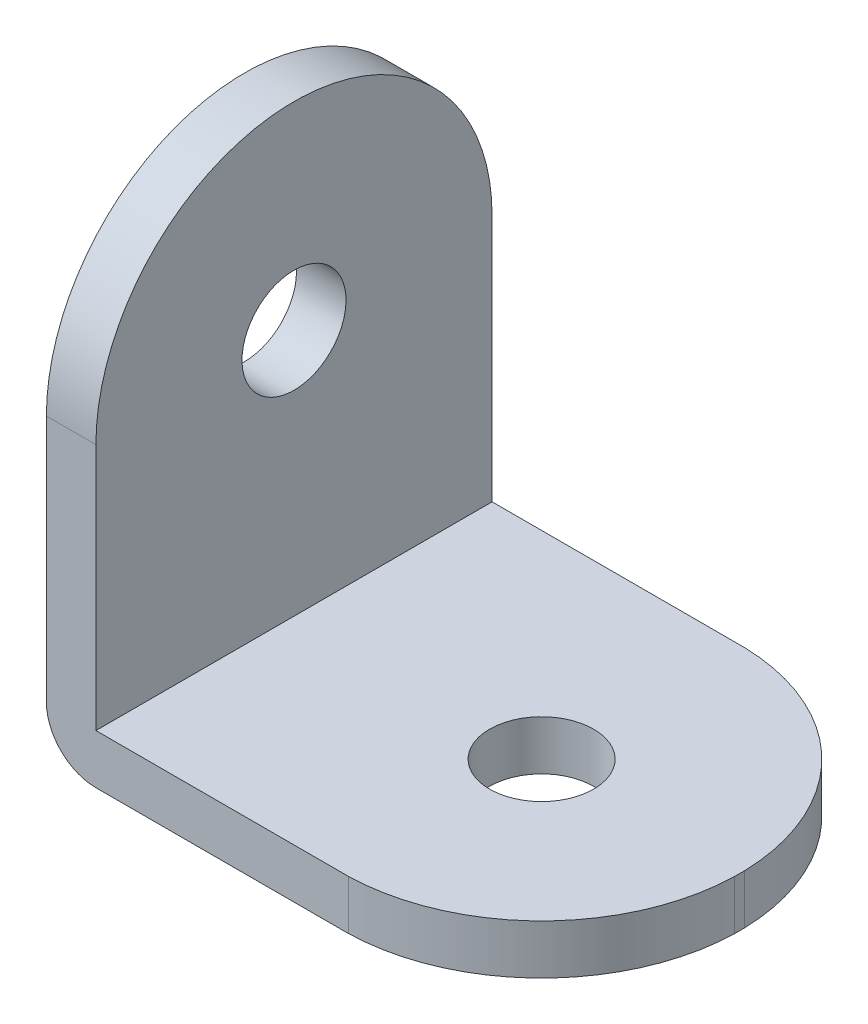
ISO-10303-21;
HEADER;
FILE_DESCRIPTION(('STEP AP214'),'2;1');
FILE_NAME('part.step','',(''),(''),'','','');
FILE_SCHEMA(('AUTOMOTIVE_DESIGN { 1 0 10303 214 1 1 1 1 }'));
ENDSEC;
DATA;
#1=APPLICATION_CONTEXT('core data for automotive mechanical design processes');
#2=APPLICATION_PROTOCOL_DEFINITION('international standard','automotive_design',2000,#1);
#3=PRODUCT_CONTEXT('',#1,'mechanical');
#4=PRODUCT('Part','Part','',(#3));
#5=PRODUCT_RELATED_PRODUCT_CATEGORY('part','',(#4));
#6=PRODUCT_DEFINITION_FORMATION('','',#4);
#7=PRODUCT_DEFINITION_CONTEXT('part definition',#1,'design');
#8=PRODUCT_DEFINITION('design','',#6,#7);
#9=PRODUCT_DEFINITION_SHAPE('','',#8);
#10=(LENGTH_UNIT() NAMED_UNIT(*) SI_UNIT(.MILLI.,.METRE.));
#11=(NAMED_UNIT(*) PLANE_ANGLE_UNIT() SI_UNIT($,.RADIAN.));
#12=(NAMED_UNIT(*) SI_UNIT($,.STERADIAN.) SOLID_ANGLE_UNIT());
#13=UNCERTAINTY_MEASURE_WITH_UNIT(LENGTH_MEASURE(1.E-05),#10,'distance_accuracy_value','');
#14=(GEOMETRIC_REPRESENTATION_CONTEXT(3) GLOBAL_UNCERTAINTY_ASSIGNED_CONTEXT((#13)) GLOBAL_UNIT_ASSIGNED_CONTEXT((#10,
#11,#12)) REPRESENTATION_CONTEXT('',''));
#15=CARTESIAN_POINT('',(0.,0.,0.));
#16=DIRECTION('',(0.,0.,1.));
#17=DIRECTION('',(1.,0.,0.));
#18=AXIS2_PLACEMENT_3D('',#15,#16,#17);
#19=CARTESIAN_POINT('',(-10.,-10.,16.));
#20=DIRECTION('',(1.,0.,0.));
#21=DIRECTION('',(0.,0.,-1.));
#22=AXIS2_PLACEMENT_3D('',#19,#20,#21);
#23=PLANE('',#22);
#24=CARTESIAN_POINT('',(-10.,2.,8.));
#25=DIRECTION('',(1.,0.,0.));
#26=DIRECTION('',(0.,0.,-1.));
#27=AXIS2_PLACEMENT_3D('',#24,#25,#26);
#28=CIRCLE('',#27,2.1);
#29=CARTESIAN_POINT('',(-10.,2.,5.9));
#30=VERTEX_POINT('',#29);
#31=EDGE_CURVE('E158',#30,#30,#28,.T.);
#32=ORIENTED_EDGE('',*,*,#31,.T.);
#33=EDGE_LOOP('',(#32));
#34=FACE_BOUND('',#33,.T.);
#35=DIRECTION('',(0.,0.,1.));
#36=VECTOR('',#35,1.);
#37=CARTESIAN_POINT('',(-10.,-7.99999999999999,0.));
#38=LINE('',#37,#36);
#39=CARTESIAN_POINT('',(-10.,-7.99999999999999,0.));
#40=VERTEX_POINT('',#39);
#41=CARTESIAN_POINT('',(-10.,-7.99999999999999,16.));
#42=VERTEX_POINT('',#41);
#43=EDGE_CURVE('E108',#40,#42,#38,.T.);
#44=ORIENTED_EDGE('',*,*,#43,.T.);
#45=DIRECTION('',(0.,-1.,0.));
#46=VECTOR('',#45,1.);
#47=CARTESIAN_POINT('',(-10.,-10.,16.));
#48=LINE('',#47,#46);
#49=CARTESIAN_POINT('',(-10.,2.,16.));
#50=VERTEX_POINT('',#49);
#51=EDGE_CURVE('E130',#50,#42,#48,.T.);
#52=ORIENTED_EDGE('',*,*,#51,.F.);
#53=CARTESIAN_POINT('',(-10.,2.,8.));
#54=DIRECTION('',(1.,0.,0.));
#55=DIRECTION('',(0.,0.,-1.));
#56=AXIS2_PLACEMENT_3D('',#53,#54,#55);
#57=CIRCLE('',#56,8.);
#58=CARTESIAN_POINT('',(-10.,2.,0.));
#59=VERTEX_POINT('',#58);
#60=EDGE_CURVE('E127',#50,#59,#57,.F.);
#61=ORIENTED_EDGE('',*,*,#60,.T.);
#62=DIRECTION('',(0.,-1.,0.));
#63=VECTOR('',#62,1.);
#64=CARTESIAN_POINT('',(-10.,-10.,0.));
#65=LINE('',#64,#63);
#66=EDGE_CURVE('E124',#59,#40,#65,.T.);
#67=ORIENTED_EDGE('',*,*,#66,.T.);
#68=EDGE_LOOP('',(#44,#52,#61,#67));
#69=FACE_BOUND('',#68,.T.);
#70=ADVANCED_FACE('F40',(#34,#69),#23,.F.);
#71=CARTESIAN_POINT('',(0.,0.,0.));
#72=DIRECTION('',(0.,0.,1.));
#73=DIRECTION('',(1.,0.,0.));
#74=AXIS2_PLACEMENT_3D('',#71,#72,#73);
#75=PLANE('',#74);
#76=DIRECTION('',(1.,0.,0.));
#77=VECTOR('',#76,1.);
#78=CARTESIAN_POINT('',(10.,-10.,0.));
#79=LINE('',#78,#77);
#80=CARTESIAN_POINT('',(-8.,-10.,0.));
#81=VERTEX_POINT('',#80);
#82=CARTESIAN_POINT('',(2.20117887972488,-10.,0.));
#83=VERTEX_POINT('',#82);
#84=EDGE_CURVE('E125',#81,#83,#79,.T.);
#85=ORIENTED_EDGE('',*,*,#84,.F.);
#86=CARTESIAN_POINT('',(-8.,-8.,0.));
#87=DIRECTION('',(0.,0.,-1.));
#88=DIRECTION('',(1.,0.,0.));
#89=AXIS2_PLACEMENT_3D('',#86,#87,#88);
#90=CIRCLE('',#89,2.);
#91=EDGE_CURVE('E111',#81,#40,#90,.T.);
#92=ORIENTED_EDGE('',*,*,#91,.T.);
#93=ORIENTED_EDGE('',*,*,#66,.F.);
#94=DIRECTION('',(1.,0.,0.));
#95=VECTOR('',#94,1.);
#96=CARTESIAN_POINT('',(-24.,2.,0.));
#97=LINE('',#96,#95);
#98=CARTESIAN_POINT('',(-8.,2.,0.));
#99=VERTEX_POINT('',#98);
#100=EDGE_CURVE('E11',#99,#59,#97,.F.);
#101=ORIENTED_EDGE('',*,*,#100,.F.);
#102=DIRECTION('',(0.,-1.,0.));
#103=VECTOR('',#102,1.);
#104=CARTESIAN_POINT('',(-8.00000000000001,10.,0.));
#105=LINE('',#104,#103);
#106=CARTESIAN_POINT('',(-8.,-8.,0.));
#107=VERTEX_POINT('',#106);
#108=EDGE_CURVE('E155',#99,#107,#105,.T.);
#109=ORIENTED_EDGE('',*,*,#108,.T.);
#110=DIRECTION('',(1.,0.,0.));
#111=VECTOR('',#110,1.);
#112=CARTESIAN_POINT('',(-8.,-8.,0.));
#113=LINE('',#112,#111);
#114=CARTESIAN_POINT('',(2.20117887972488,-8.,0.));
#115=VERTEX_POINT('',#114);
#116=EDGE_CURVE('E150',#107,#115,#113,.T.);
#117=ORIENTED_EDGE('',*,*,#116,.T.);
#118=DIRECTION('',(0.,1.,0.));
#119=VECTOR('',#118,1.);
#120=CARTESIAN_POINT('',(2.20117887972488,-24.,0.));
#121=LINE('',#120,#119);
#122=EDGE_CURVE('E62',#83,#115,#121,.T.);
#123=ORIENTED_EDGE('',*,*,#122,.F.);
#124=EDGE_LOOP('',(#85,#92,#93,#101,#109,#117,#123));
#125=FACE_BOUND('',#124,.T.);
#126=ADVANCED_FACE('F122',(#125),#75,.F.);
#127=CARTESIAN_POINT('',(0.,0.,16.));
#128=DIRECTION('',(0.,0.,1.));
#129=DIRECTION('',(1.,0.,0.));
#130=AXIS2_PLACEMENT_3D('',#127,#128,#129);
#131=PLANE('',#130);
#132=CARTESIAN_POINT('',(-8.,-8.,16.));
#133=DIRECTION('',(0.,0.,-1.));
#134=DIRECTION('',(1.,0.,0.));
#135=AXIS2_PLACEMENT_3D('',#132,#133,#134);
#136=CIRCLE('',#135,2.);
#137=CARTESIAN_POINT('',(-8.,-10.,16.));
#138=VERTEX_POINT('',#137);
#139=EDGE_CURVE('E54',#138,#42,#136,.T.);
#140=ORIENTED_EDGE('',*,*,#139,.F.);
#141=DIRECTION('',(1.,0.,0.));
#142=VECTOR('',#141,1.);
#143=CARTESIAN_POINT('',(10.,-10.,16.));
#144=LINE('',#143,#142);
#145=CARTESIAN_POINT('',(2.20117887972485,-10.,16.));
#146=VERTEX_POINT('',#145);
#147=EDGE_CURVE('E136',#138,#146,#144,.T.);
#148=ORIENTED_EDGE('',*,*,#147,.T.);
#149=DIRECTION('',(0.,1.,0.));
#150=VECTOR('',#149,1.);
#151=CARTESIAN_POINT('',(2.20117887972485,-24.,16.));
#152=LINE('',#151,#150);
#153=CARTESIAN_POINT('',(2.20117887972485,-8.,16.));
#154=VERTEX_POINT('',#153);
#155=EDGE_CURVE('E182',#146,#154,#152,.T.);
#156=ORIENTED_EDGE('',*,*,#155,.T.);
#157=DIRECTION('',(1.,0.,0.));
#158=VECTOR('',#157,1.);
#159=CARTESIAN_POINT('',(-8.,-8.,16.));
#160=LINE('',#159,#158);
#161=CARTESIAN_POINT('',(-8.,-8.,16.));
#162=VERTEX_POINT('',#161);
#163=EDGE_CURVE('E152',#162,#154,#160,.T.);
#164=ORIENTED_EDGE('',*,*,#163,.F.);
#165=DIRECTION('',(0.,-1.,0.));
#166=VECTOR('',#165,1.);
#167=CARTESIAN_POINT('',(-8.00000000000001,10.,16.));
#168=LINE('',#167,#166);
#169=CARTESIAN_POINT('',(-8.,2.,16.));
#170=VERTEX_POINT('',#169);
#171=EDGE_CURVE('E156',#170,#162,#168,.T.);
#172=ORIENTED_EDGE('',*,*,#171,.F.);
#173=DIRECTION('',(1.,0.,0.));
#174=VECTOR('',#173,1.);
#175=CARTESIAN_POINT('',(-24.,2.,16.));
#176=LINE('',#175,#174);
#177=EDGE_CURVE('E174',#50,#170,#176,.T.);
#178=ORIENTED_EDGE('',*,*,#177,.F.);
#179=ORIENTED_EDGE('',*,*,#51,.T.);
#180=EDGE_LOOP('',(#140,#148,#156,#164,#172,#178,#179));
#181=FACE_BOUND('',#180,.T.);
#182=ADVANCED_FACE('F196',(#181),#131,.T.);
#183=CARTESIAN_POINT('',(10.,-10.,16.));
#184=DIRECTION('',(0.,1.,0.));
#185=DIRECTION('',(-1.,0.,0.));
#186=AXIS2_PLACEMENT_3D('',#183,#184,#185);
#187=PLANE('',#186);
#188=CARTESIAN_POINT('',(2.,-10.,8.));
#189=DIRECTION('',(0.,1.,0.));
#190=DIRECTION('',(-1.,0.,0.));
#191=AXIS2_PLACEMENT_3D('',#188,#189,#190);
#192=CIRCLE('',#191,2.1);
#193=CARTESIAN_POINT('',(-0.100000000000005,-10.,8.));
#194=VERTEX_POINT('',#193);
#195=EDGE_CURVE('E167',#194,#194,#192,.T.);
#196=ORIENTED_EDGE('',*,*,#195,.T.);
#197=EDGE_LOOP('',(#196));
#198=FACE_BOUND('',#197,.T.);
#199=ORIENTED_EDGE('',*,*,#147,.F.);
#200=DIRECTION('',(0.,0.,1.));
#201=VECTOR('',#200,1.);
#202=CARTESIAN_POINT('',(-8.,-10.,0.));
#203=LINE('',#202,#201);
#204=EDGE_CURVE('E117',#81,#138,#203,.T.);
#205=ORIENTED_EDGE('',*,*,#204,.F.);
#206=ORIENTED_EDGE('',*,*,#84,.T.);
#207=CARTESIAN_POINT('',(2.,-10.,8.));
#208=DIRECTION('',(0.,1.,0.));
#209=DIRECTION('',(-1.,0.,0.));
#210=AXIS2_PLACEMENT_3D('',#207,#208,#209);
#211=CIRCLE('',#210,8.00252915906261);
#212=CARTESIAN_POINT('',(9.99999999999999,-10.,7.79882112027512));
#213=VERTEX_POINT('',#212);
#214=EDGE_CURVE('E178',#213,#83,#211,.T.);
#215=ORIENTED_EDGE('',*,*,#214,.F.);
#216=DIRECTION('',(0.,0.,-1.));
#217=VECTOR('',#216,1.);
#218=CARTESIAN_POINT('',(10.,-10.,16.));
#219=LINE('',#218,#217);
#220=CARTESIAN_POINT('',(9.99999999999999,-10.,8.20117887972488));
#221=VERTEX_POINT('',#220);
#222=EDGE_CURVE('E47',#221,#213,#219,.T.);
#223=ORIENTED_EDGE('',*,*,#222,.F.);
#224=CARTESIAN_POINT('',(2.,-10.,8.));
#225=DIRECTION('',(0.,1.,0.));
#226=DIRECTION('',(-1.,0.,0.));
#227=AXIS2_PLACEMENT_3D('',#224,#225,#226);
#228=CIRCLE('',#227,8.00252915906261);
#229=EDGE_CURVE('E180',#146,#221,#228,.T.);
#230=ORIENTED_EDGE('',*,*,#229,.F.);
#231=EDGE_LOOP('',(#199,#205,#206,#215,#223,#230));
#232=FACE_BOUND('',#231,.T.);
#233=ADVANCED_FACE('F198',(#198,#232),#187,.F.);
#234=CARTESIAN_POINT('',(10.,-10.,16.));
#235=DIRECTION('',(-1.,0.,0.));
#236=DIRECTION('',(0.,0.,1.));
#237=AXIS2_PLACEMENT_3D('',#234,#235,#236);
#238=PLANE('',#237);
#239=DIRECTION('',(0.,1.,0.));
#240=VECTOR('',#239,1.);
#241=CARTESIAN_POINT('',(9.99999999999999,-24.,7.79882112027512));
#242=LINE('',#241,#240);
#243=CARTESIAN_POINT('',(9.99999999999999,-8.,7.79882112027512));
#244=VERTEX_POINT('',#243);
#245=EDGE_CURVE('E190',#213,#244,#242,.T.);
#246=ORIENTED_EDGE('',*,*,#245,.T.);
#247=DIRECTION('',(0.,0.,1.));
#248=VECTOR('',#247,1.);
#249=CARTESIAN_POINT('',(10.,-8.,0.));
#250=LINE('',#249,#248);
#251=CARTESIAN_POINT('',(10.,-8.,8.20117887972488));
#252=VERTEX_POINT('',#251);
#253=EDGE_CURVE('E128',#244,#252,#250,.T.);
#254=ORIENTED_EDGE('',*,*,#253,.T.);
#255=DIRECTION('',(0.,1.,0.));
#256=VECTOR('',#255,1.);
#257=CARTESIAN_POINT('',(9.99999999999999,-24.,8.20117887972488));
#258=LINE('',#257,#256);
#259=EDGE_CURVE('E184',#221,#252,#258,.T.);
#260=ORIENTED_EDGE('',*,*,#259,.F.);
#261=ORIENTED_EDGE('',*,*,#222,.T.);
#262=EDGE_LOOP('',(#246,#254,#260,#261));
#263=FACE_BOUND('',#262,.T.);
#264=ADVANCED_FACE('F202',(#263),#238,.F.);
#265=CARTESIAN_POINT('',(-8.,-8.,0.));
#266=DIRECTION('',(0.,-1.,0.));
#267=DIRECTION('',(1.,0.,0.));
#268=AXIS2_PLACEMENT_3D('',#265,#266,#267);
#269=PLANE('',#268);
#270=CARTESIAN_POINT('',(2.,-8.,8.));
#271=DIRECTION('',(0.,1.,0.));
#272=DIRECTION('',(-1.,0.,0.));
#273=AXIS2_PLACEMENT_3D('',#270,#271,#272);
#274=CIRCLE('',#273,2.1);
#275=CARTESIAN_POINT('',(-0.100000000000005,-8.,8.));
#276=VERTEX_POINT('',#275);
#277=EDGE_CURVE('E170',#276,#276,#274,.T.);
#278=ORIENTED_EDGE('',*,*,#277,.F.);
#279=EDGE_LOOP('',(#278));
#280=FACE_BOUND('',#279,.T.);
#281=CARTESIAN_POINT('',(2.,-8.,8.));
#282=DIRECTION('',(0.,1.,0.));
#283=DIRECTION('',(-1.,0.,0.));
#284=AXIS2_PLACEMENT_3D('',#281,#282,#283);
#285=CIRCLE('',#284,8.00252915906261);
#286=EDGE_CURVE('E187',#244,#115,#285,.T.);
#287=ORIENTED_EDGE('',*,*,#286,.T.);
#288=ORIENTED_EDGE('',*,*,#116,.F.);
#289=DIRECTION('',(0.,0.,1.));
#290=VECTOR('',#289,1.);
#291=CARTESIAN_POINT('',(-8.,-8.,0.));
#292=LINE('',#291,#290);
#293=EDGE_CURVE('E133',#107,#162,#292,.T.);
#294=ORIENTED_EDGE('',*,*,#293,.T.);
#295=ORIENTED_EDGE('',*,*,#163,.T.);
#296=CARTESIAN_POINT('',(2.,-8.,8.));
#297=DIRECTION('',(0.,1.,0.));
#298=DIRECTION('',(-1.,0.,0.));
#299=AXIS2_PLACEMENT_3D('',#296,#297,#298);
#300=CIRCLE('',#299,8.00252915906261);
#301=EDGE_CURVE('E185',#154,#252,#300,.T.);
#302=ORIENTED_EDGE('',*,*,#301,.T.);
#303=ORIENTED_EDGE('',*,*,#253,.F.);
#304=EDGE_LOOP('',(#287,#288,#294,#295,#302,#303));
#305=FACE_BOUND('',#304,.T.);
#306=ADVANCED_FACE('F205',(#280,#305),#269,.F.);
#307=CARTESIAN_POINT('',(-8.00000000000001,10.,0.));
#308=DIRECTION('',(-1.,0.,0.));
#309=DIRECTION('',(0.,-1.,0.));
#310=AXIS2_PLACEMENT_3D('',#307,#308,#309);
#311=PLANE('',#310);
#312=CARTESIAN_POINT('',(-8.,2.,8.));
#313=DIRECTION('',(1.,0.,0.));
#314=DIRECTION('',(0.,1.,0.));
#315=AXIS2_PLACEMENT_3D('',#312,#313,#314);
#316=CIRCLE('',#315,2.1);
#317=CARTESIAN_POINT('',(-8.,4.1,8.));
#318=VERTEX_POINT('',#317);
#319=EDGE_CURVE('E164',#318,#318,#316,.T.);
#320=ORIENTED_EDGE('',*,*,#319,.F.);
#321=EDGE_LOOP('',(#320));
#322=FACE_BOUND('',#321,.T.);
#323=ORIENTED_EDGE('',*,*,#108,.F.);
#324=CARTESIAN_POINT('',(-8.,2.,8.));
#325=DIRECTION('',(1.,0.,0.));
#326=DIRECTION('',(0.,1.,0.));
#327=AXIS2_PLACEMENT_3D('',#324,#325,#326);
#328=CIRCLE('',#327,8.);
#329=EDGE_CURVE('E176',#170,#99,#328,.F.);
#330=ORIENTED_EDGE('',*,*,#329,.F.);
#331=ORIENTED_EDGE('',*,*,#171,.T.);
#332=ORIENTED_EDGE('',*,*,#293,.F.);
#333=EDGE_LOOP('',(#323,#330,#331,#332));
#334=FACE_BOUND('',#333,.T.);
#335=ADVANCED_FACE('F213',(#322,#334),#311,.F.);
#336=CARTESIAN_POINT('',(-24.,2.,8.));
#337=DIRECTION('',(1.,0.,0.));
#338=DIRECTION('',(0.,1.,0.));
#339=AXIS2_PLACEMENT_3D('',#336,#337,#338);
#340=CYLINDRICAL_SURFACE('',#339,2.1);
#341=ORIENTED_EDGE('',*,*,#319,.T.);
#342=EDGE_LOOP('',(#341));
#343=FACE_BOUND('',#342,.T.);
#344=ORIENTED_EDGE('',*,*,#31,.F.);
#345=EDGE_LOOP('',(#344));
#346=FACE_BOUND('',#345,.T.);
#347=ADVANCED_FACE('F225',(#343,#346),#340,.F.);
#348=CARTESIAN_POINT('',(1.99999999999999,-24.,8.));
#349=DIRECTION('',(0.,1.,0.));
#350=DIRECTION('',(-1.,0.,0.));
#351=AXIS2_PLACEMENT_3D('',#348,#349,#350);
#352=CYLINDRICAL_SURFACE('',#351,2.1);
#353=ORIENTED_EDGE('',*,*,#277,.T.);
#354=EDGE_LOOP('',(#353));
#355=FACE_BOUND('',#354,.T.);
#356=ORIENTED_EDGE('',*,*,#195,.F.);
#357=EDGE_LOOP('',(#356));
#358=FACE_BOUND('',#357,.T.);
#359=ADVANCED_FACE('F217',(#355,#358),#352,.F.);
#360=CARTESIAN_POINT('',(-24.,2.,8.));
#361=DIRECTION('',(1.,0.,0.));
#362=DIRECTION('',(0.,1.,0.));
#363=AXIS2_PLACEMENT_3D('',#360,#361,#362);
#364=CYLINDRICAL_SURFACE('',#363,8.);
#365=ORIENTED_EDGE('',*,*,#177,.T.);
#366=ORIENTED_EDGE('',*,*,#329,.T.);
#367=ORIENTED_EDGE('',*,*,#100,.T.);
#368=ORIENTED_EDGE('',*,*,#60,.F.);
#369=EDGE_LOOP('',(#365,#366,#367,#368));
#370=FACE_BOUND('',#369,.T.);
#371=ADVANCED_FACE('F215',(#370),#364,.T.);
#372=CARTESIAN_POINT('',(1.99999999999999,-24.,8.));
#373=DIRECTION('',(0.,1.,0.));
#374=DIRECTION('',(-1.,0.,0.));
#375=AXIS2_PLACEMENT_3D('',#372,#373,#374);
#376=CYLINDRICAL_SURFACE('',#375,8.00252915906261);
#377=ORIENTED_EDGE('',*,*,#229,.T.);
#378=ORIENTED_EDGE('',*,*,#259,.T.);
#379=ORIENTED_EDGE('',*,*,#301,.F.);
#380=ORIENTED_EDGE('',*,*,#155,.F.);
#381=EDGE_LOOP('',(#377,#378,#379,#380));
#382=FACE_BOUND('',#381,.T.);
#383=ADVANCED_FACE('F201',(#382),#376,.T.);
#384=CARTESIAN_POINT('',(1.99999999999999,-24.,8.));
#385=DIRECTION('',(0.,1.,0.));
#386=DIRECTION('',(-1.,0.,0.));
#387=AXIS2_PLACEMENT_3D('',#384,#385,#386);
#388=CYLINDRICAL_SURFACE('',#387,8.00252915906261);
#389=ORIENTED_EDGE('',*,*,#214,.T.);
#390=ORIENTED_EDGE('',*,*,#122,.T.);
#391=ORIENTED_EDGE('',*,*,#286,.F.);
#392=ORIENTED_EDGE('',*,*,#245,.F.);
#393=EDGE_LOOP('',(#389,#390,#391,#392));
#394=FACE_BOUND('',#393,.T.);
#395=ADVANCED_FACE('F223',(#394),#388,.T.);
#396=CARTESIAN_POINT('',(-8.,-8.,0.));
#397=DIRECTION('',(0.,0.,1.));
#398=DIRECTION('',(1.,0.,0.));
#399=AXIS2_PLACEMENT_3D('',#396,#397,#398);
#400=CYLINDRICAL_SURFACE('',#399,2.);
#401=ORIENTED_EDGE('',*,*,#139,.T.);
#402=ORIENTED_EDGE('',*,*,#43,.F.);
#403=ORIENTED_EDGE('',*,*,#91,.F.);
#404=ORIENTED_EDGE('',*,*,#204,.T.);
#405=EDGE_LOOP('',(#401,#402,#403,#404));
#406=FACE_BOUND('',#405,.T.);
#407=ADVANCED_FACE('F110',(#406),#400,.T.);
#408=CLOSED_SHELL('',(#70,#126,#182,#233,#264,#306,#335,#347,#359,#371,#383,#395,#407));
#409=MANIFOLD_SOLID_BREP('B2',#408);
#410=ADVANCED_BREP_SHAPE_REPRESENTATION('',(#18,#409),#14);
#411=SHAPE_DEFINITION_REPRESENTATION(#9,#410);
ENDSEC;
END-ISO-10303-21;
